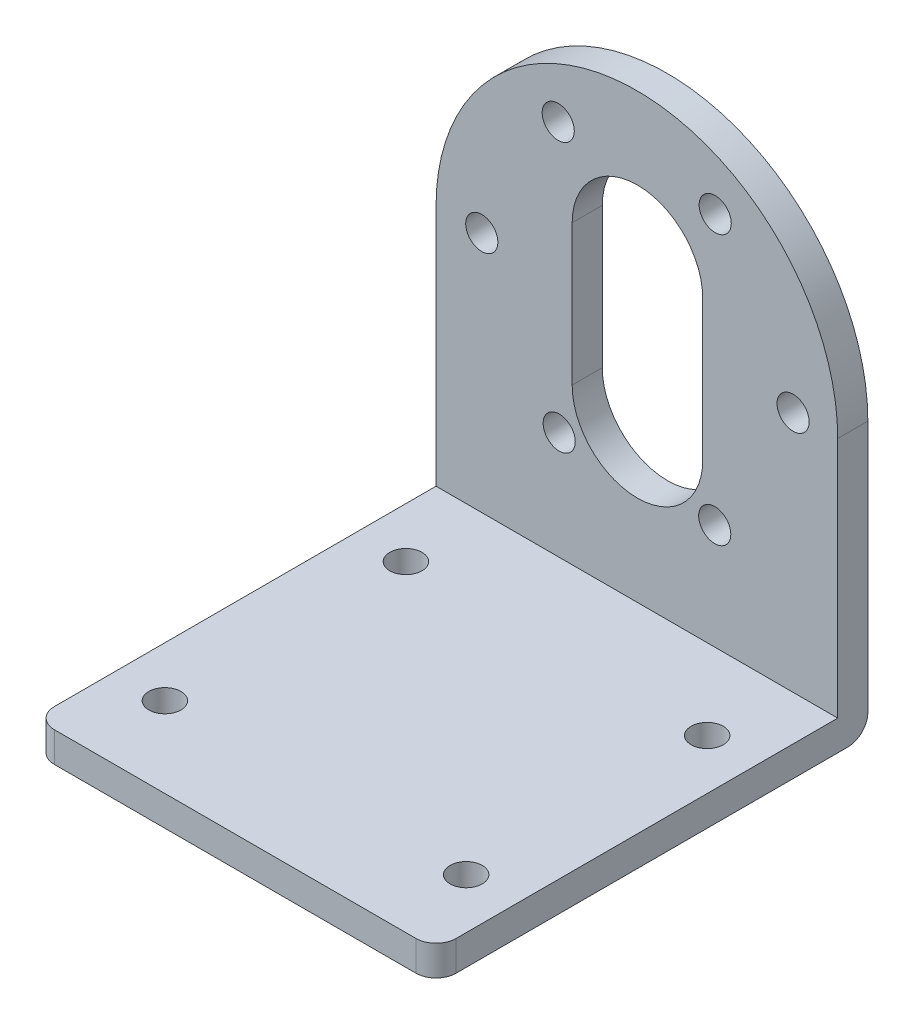
ISO-10303-21;
HEADER;
FILE_DESCRIPTION(('STEP AP214'),'2;1');
FILE_NAME('part.step','',(''),(''),'','','');
FILE_SCHEMA(('AUTOMOTIVE_DESIGN { 1 0 10303 214 1 1 1 1 }'));
ENDSEC;
DATA;
#1=APPLICATION_CONTEXT('core data for automotive mechanical design processes');
#2=APPLICATION_PROTOCOL_DEFINITION('international standard','automotive_design',2000,#1);
#3=PRODUCT_CONTEXT('',#1,'mechanical');
#4=PRODUCT('Part','Part','',(#3));
#5=PRODUCT_RELATED_PRODUCT_CATEGORY('part','',(#4));
#6=PRODUCT_DEFINITION_FORMATION('','',#4);
#7=PRODUCT_DEFINITION_CONTEXT('part definition',#1,'design');
#8=PRODUCT_DEFINITION('design','',#6,#7);
#9=PRODUCT_DEFINITION_SHAPE('','',#8);
#10=(LENGTH_UNIT() NAMED_UNIT(*) SI_UNIT(.MILLI.,.METRE.));
#11=(NAMED_UNIT(*) PLANE_ANGLE_UNIT() SI_UNIT($,.RADIAN.));
#12=(NAMED_UNIT(*) SI_UNIT($,.STERADIAN.) SOLID_ANGLE_UNIT());
#13=UNCERTAINTY_MEASURE_WITH_UNIT(LENGTH_MEASURE(1.E-05),#10,'distance_accuracy_value','');
#14=(GEOMETRIC_REPRESENTATION_CONTEXT(3) GLOBAL_UNCERTAINTY_ASSIGNED_CONTEXT((#13)) GLOBAL_UNIT_ASSIGNED_CONTEXT((#10,
#11,#12)) REPRESENTATION_CONTEXT('',''));
#15=CARTESIAN_POINT('',(0.,0.,0.));
#16=DIRECTION('',(0.,0.,1.));
#17=DIRECTION('',(1.,0.,0.));
#18=AXIS2_PLACEMENT_3D('',#15,#16,#17);
#19=CARTESIAN_POINT('',(2.78694441785257,18.9087809015992,2.99999999999998));
#20=DIRECTION('',(0.,0.,-1.));
#21=DIRECTION('',(-1.,0.,0.));
#22=AXIS2_PLACEMENT_3D('',#19,#20,#21);
#23=CYLINDRICAL_SURFACE('',#22,20.);
#24=CARTESIAN_POINT('',(2.78694441785257,18.9087809015992,0.));
#25=DIRECTION('',(0.,0.,1.));
#26=DIRECTION('',(1.,0.,0.));
#27=AXIS2_PLACEMENT_3D('',#24,#25,#26);
#28=CIRCLE('',#27,20.);
#29=CARTESIAN_POINT('',(-17.2130555821474,18.9087809015992,0.));
#30=VERTEX_POINT('',#29);
#31=CARTESIAN_POINT('',(22.7869444178526,18.9087809015992,0.));
#32=VERTEX_POINT('',#31);
#33=EDGE_CURVE('E213',#30,#32,#28,.F.);
#34=ORIENTED_EDGE('',*,*,#33,.F.);
#35=DIRECTION('',(0.,0.,-1.));
#36=VECTOR('',#35,1.);
#37=CARTESIAN_POINT('',(-17.2130555821474,18.9087809015992,2.99999999999998));
#38=LINE('',#37,#36);
#39=CARTESIAN_POINT('',(-17.2130555821474,18.9087809015992,2.99999999999998));
#40=VERTEX_POINT('',#39);
#41=EDGE_CURVE('E228',#40,#30,#38,.T.);
#42=ORIENTED_EDGE('',*,*,#41,.F.);
#43=CARTESIAN_POINT('',(2.78694441785257,18.9087809015992,2.99999999999998));
#44=DIRECTION('',(0.,0.,1.));
#45=DIRECTION('',(1.,0.,0.));
#46=AXIS2_PLACEMENT_3D('',#43,#44,#45);
#47=CIRCLE('',#46,20.);
#48=CARTESIAN_POINT('',(22.7869444178526,18.9087809015992,2.99999999999998));
#49=VERTEX_POINT('',#48);
#50=EDGE_CURVE('E163',#40,#49,#47,.F.);
#51=ORIENTED_EDGE('',*,*,#50,.T.);
#52=DIRECTION('',(0.,0.,-1.));
#53=VECTOR('',#52,1.);
#54=CARTESIAN_POINT('',(22.7869444178526,18.9087809015992,2.99999999999998));
#55=LINE('',#54,#53);
#56=EDGE_CURVE('E224',#49,#32,#55,.T.);
#57=ORIENTED_EDGE('',*,*,#56,.T.);
#58=EDGE_LOOP('',(#34,#42,#51,#57));
#59=FACE_BOUND('',#58,.T.);
#60=ADVANCED_FACE('F41',(#59),#23,.T.);
#61=CARTESIAN_POINT('',(-17.2130555821474,0.,2.99999999999998));
#62=DIRECTION('',(-1.,0.,0.));
#63=DIRECTION('',(0.,0.,1.));
#64=AXIS2_PLACEMENT_3D('',#61,#62,#63);
#65=PLANE('',#64);
#66=DIRECTION('',(0.,1.,0.));
#67=VECTOR('',#66,1.);
#68=CARTESIAN_POINT('',(-17.2130555821474,0.,0.));
#69=LINE('',#68,#67);
#70=CARTESIAN_POINT('',(-17.2130555821474,-6.20395057940297,0.));
#71=VERTEX_POINT('',#70);
#72=EDGE_CURVE('E217',#71,#30,#69,.T.);
#73=ORIENTED_EDGE('',*,*,#72,.F.);
#74=CARTESIAN_POINT('',(-17.2130555821474,-6.20395057940297,2.));
#75=DIRECTION('',(-1.,0.,0.));
#76=DIRECTION('',(0.,0.,1.));
#77=AXIS2_PLACEMENT_3D('',#74,#75,#76);
#78=CIRCLE('',#77,2.);
#79=CARTESIAN_POINT('',(-17.2130555821474,-8.20395057940297,2.));
#80=VERTEX_POINT('',#79);
#81=EDGE_CURVE('E11',#71,#80,#78,.T.);
#82=ORIENTED_EDGE('',*,*,#81,.T.);
#83=DIRECTION('',(0.,0.,-1.));
#84=VECTOR('',#83,1.);
#85=CARTESIAN_POINT('',(-17.2130555821474,-8.20395057940297,43.));
#86=LINE('',#85,#84);
#87=CARTESIAN_POINT('',(-17.2130555821474,-8.20395057940297,41.));
#88=VERTEX_POINT('',#87);
#89=EDGE_CURVE('E148',#88,#80,#86,.T.);
#90=ORIENTED_EDGE('',*,*,#89,.F.);
#91=DIRECTION('',(0.,-1.,0.));
#92=VECTOR('',#91,1.);
#93=CARTESIAN_POINT('',(-17.2130555821474,-5.20395057940296,41.));
#94=LINE('',#93,#92);
#95=CARTESIAN_POINT('',(-17.2130555821474,-5.20395057940296,41.));
#96=VERTEX_POINT('',#95);
#97=EDGE_CURVE('E143',#88,#96,#94,.F.);
#98=ORIENTED_EDGE('',*,*,#97,.T.);
#99=DIRECTION('',(0.,0.,-1.));
#100=VECTOR('',#99,1.);
#101=CARTESIAN_POINT('',(-17.2130555821474,-5.20395057940296,43.));
#102=LINE('',#101,#100);
#103=CARTESIAN_POINT('',(-17.2130555821474,-5.20395057940296,2.99999999999998));
#104=VERTEX_POINT('',#103);
#105=EDGE_CURVE('E135',#96,#104,#102,.T.);
#106=ORIENTED_EDGE('',*,*,#105,.T.);
#107=DIRECTION('',(0.,1.,0.));
#108=VECTOR('',#107,1.);
#109=CARTESIAN_POINT('',(-17.2130555821474,0.,2.99999999999998));
#110=LINE('',#109,#108);
#111=EDGE_CURVE('E140',#104,#40,#110,.T.);
#112=ORIENTED_EDGE('',*,*,#111,.T.);
#113=ORIENTED_EDGE('',*,*,#41,.T.);
#114=EDGE_LOOP('',(#73,#82,#90,#98,#106,#112,#113));
#115=FACE_BOUND('',#114,.T.);
#116=ADVANCED_FACE('F137',(#115),#65,.T.);
#117=CARTESIAN_POINT('',(2.84331015835363,24.296049420597,2.99999999999998));
#118=DIRECTION('',(0.,0.,-1.));
#119=DIRECTION('',(-1.,0.,0.));
#120=AXIS2_PLACEMENT_3D('',#117,#118,#119);
#121=CYLINDRICAL_SURFACE('',#120,6.5);
#122=CARTESIAN_POINT('',(2.84331015835363,24.296049420597,0.));
#123=DIRECTION('',(0.,0.,1.));
#124=DIRECTION('',(1.,0.,0.));
#125=AXIS2_PLACEMENT_3D('',#122,#123,#124);
#126=CIRCLE('',#125,6.5);
#127=CARTESIAN_POINT('',(9.34331015835363,24.296049420597,0.));
#128=VERTEX_POINT('',#127);
#129=CARTESIAN_POINT('',(-3.65668984164637,24.296049420597,0.));
#130=VERTEX_POINT('',#129);
#131=EDGE_CURVE('E197',#128,#130,#126,.T.);
#132=ORIENTED_EDGE('',*,*,#131,.F.);
#133=DIRECTION('',(0.,0.,-1.));
#134=VECTOR('',#133,1.);
#135=CARTESIAN_POINT('',(9.34331015835363,24.296049420597,2.99999999999998));
#136=LINE('',#135,#134);
#137=CARTESIAN_POINT('',(9.34331015835363,24.296049420597,2.99999999999998));
#138=VERTEX_POINT('',#137);
#139=EDGE_CURVE('E229',#138,#128,#136,.T.);
#140=ORIENTED_EDGE('',*,*,#139,.F.);
#141=CARTESIAN_POINT('',(2.84331015835363,24.296049420597,2.99999999999998));
#142=DIRECTION('',(0.,0.,1.));
#143=DIRECTION('',(1.,0.,0.));
#144=AXIS2_PLACEMENT_3D('',#141,#142,#143);
#145=CIRCLE('',#144,6.5);
#146=CARTESIAN_POINT('',(-3.65668984164637,24.296049420597,2.99999999999998));
#147=VERTEX_POINT('',#146);
#148=EDGE_CURVE('E317',#138,#147,#145,.T.);
#149=ORIENTED_EDGE('',*,*,#148,.T.);
#150=DIRECTION('',(0.,0.,-1.));
#151=VECTOR('',#150,1.);
#152=CARTESIAN_POINT('',(-3.65668984164637,24.296049420597,2.99999999999998));
#153=LINE('',#152,#151);
#154=EDGE_CURVE('E173',#147,#130,#153,.T.);
#155=ORIENTED_EDGE('',*,*,#154,.T.);
#156=EDGE_LOOP('',(#132,#140,#149,#155));
#157=FACE_BOUND('',#156,.T.);
#158=ADVANCED_FACE('F340',(#157),#121,.F.);
#159=CARTESIAN_POINT('',(9.34331015835363,0.,2.99999999999998));
#160=DIRECTION('',(-1.,0.,0.));
#161=DIRECTION('',(0.,0.,1.));
#162=AXIS2_PLACEMENT_3D('',#159,#160,#161);
#163=PLANE('',#162);
#164=DIRECTION('',(0.,1.,0.));
#165=VECTOR('',#164,1.);
#166=CARTESIAN_POINT('',(9.34331015835363,0.,0.));
#167=LINE('',#166,#165);
#168=CARTESIAN_POINT('',(9.34331015835363,10.296049420597,0.));
#169=VERTEX_POINT('',#168);
#170=EDGE_CURVE('E201',#169,#128,#167,.T.);
#171=ORIENTED_EDGE('',*,*,#170,.F.);
#172=DIRECTION('',(0.,0.,-1.));
#173=VECTOR('',#172,1.);
#174=CARTESIAN_POINT('',(9.34331015835363,10.296049420597,2.99999999999998));
#175=LINE('',#174,#173);
#176=CARTESIAN_POINT('',(9.34331015835363,10.296049420597,2.99999999999998));
#177=VERTEX_POINT('',#176);
#178=EDGE_CURVE('E238',#177,#169,#175,.T.);
#179=ORIENTED_EDGE('',*,*,#178,.F.);
#180=DIRECTION('',(0.,1.,0.));
#181=VECTOR('',#180,1.);
#182=CARTESIAN_POINT('',(9.34331015835363,0.,2.99999999999998));
#183=LINE('',#182,#181);
#184=EDGE_CURVE('E321',#177,#138,#183,.T.);
#185=ORIENTED_EDGE('',*,*,#184,.T.);
#186=ORIENTED_EDGE('',*,*,#139,.T.);
#187=EDGE_LOOP('',(#171,#179,#185,#186));
#188=FACE_BOUND('',#187,.T.);
#189=ADVANCED_FACE('F343',(#188),#163,.T.);
#190=CARTESIAN_POINT('',(2.84331015835363,10.296049420597,2.99999999999998));
#191=DIRECTION('',(0.,0.,-1.));
#192=DIRECTION('',(-1.,0.,0.));
#193=AXIS2_PLACEMENT_3D('',#190,#191,#192);
#194=CYLINDRICAL_SURFACE('',#193,6.5);
#195=CARTESIAN_POINT('',(2.84331015835363,10.296049420597,0.));
#196=DIRECTION('',(0.,0.,1.));
#197=DIRECTION('',(1.,0.,0.));
#198=AXIS2_PLACEMENT_3D('',#195,#196,#197);
#199=CIRCLE('',#198,6.5);
#200=CARTESIAN_POINT('',(-3.65668984164637,10.296049420597,0.));
#201=VERTEX_POINT('',#200);
#202=EDGE_CURVE('E205',#201,#169,#199,.T.);
#203=ORIENTED_EDGE('',*,*,#202,.F.);
#204=DIRECTION('',(0.,0.,-1.));
#205=VECTOR('',#204,1.);
#206=CARTESIAN_POINT('',(-3.65668984164637,10.296049420597,2.99999999999998));
#207=LINE('',#206,#205);
#208=CARTESIAN_POINT('',(-3.65668984164637,10.296049420597,2.99999999999998));
#209=VERTEX_POINT('',#208);
#210=EDGE_CURVE('E235',#209,#201,#207,.T.);
#211=ORIENTED_EDGE('',*,*,#210,.F.);
#212=CARTESIAN_POINT('',(2.84331015835363,10.296049420597,2.99999999999998));
#213=DIRECTION('',(0.,0.,1.));
#214=DIRECTION('',(1.,0.,0.));
#215=AXIS2_PLACEMENT_3D('',#212,#213,#214);
#216=CIRCLE('',#215,6.5);
#217=EDGE_CURVE('E325',#209,#177,#216,.T.);
#218=ORIENTED_EDGE('',*,*,#217,.T.);
#219=ORIENTED_EDGE('',*,*,#178,.T.);
#220=EDGE_LOOP('',(#203,#211,#218,#219));
#221=FACE_BOUND('',#220,.T.);
#222=ADVANCED_FACE('F346',(#221),#194,.F.);
#223=CARTESIAN_POINT('',(-3.65668984164637,0.,2.99999999999998));
#224=DIRECTION('',(-1.,0.,0.));
#225=DIRECTION('',(0.,0.,1.));
#226=AXIS2_PLACEMENT_3D('',#223,#224,#225);
#227=PLANE('',#226);
#228=DIRECTION('',(0.,1.,0.));
#229=VECTOR('',#228,1.);
#230=CARTESIAN_POINT('',(-3.65668984164637,0.,0.));
#231=LINE('',#230,#229);
#232=EDGE_CURVE('E209',#201,#130,#231,.T.);
#233=ORIENTED_EDGE('',*,*,#232,.T.);
#234=ORIENTED_EDGE('',*,*,#154,.F.);
#235=DIRECTION('',(0.,1.,0.));
#236=VECTOR('',#235,1.);
#237=CARTESIAN_POINT('',(-3.65668984164637,0.,2.99999999999998));
#238=LINE('',#237,#236);
#239=EDGE_CURVE('E167',#209,#147,#238,.T.);
#240=ORIENTED_EDGE('',*,*,#239,.F.);
#241=ORIENTED_EDGE('',*,*,#210,.T.);
#242=EDGE_LOOP('',(#233,#234,#240,#241));
#243=FACE_BOUND('',#242,.T.);
#244=ADVANCED_FACE('F336',(#243),#227,.F.);
#245=CARTESIAN_POINT('',(-12.6566898416464,18.9087809015992,2.99999999999998));
#246=DIRECTION('',(0.,0.,-1.));
#247=DIRECTION('',(-1.,0.,0.));
#248=AXIS2_PLACEMENT_3D('',#245,#246,#247);
#249=CYLINDRICAL_SURFACE('',#248,1.6);
#250=CARTESIAN_POINT('',(-12.6566898416464,18.9087809015992,2.99999999999998));
#251=DIRECTION('',(0.,0.,1.));
#252=DIRECTION('',(1.,0.,0.));
#253=AXIS2_PLACEMENT_3D('',#250,#251,#252);
#254=CIRCLE('',#253,1.6);
#255=CARTESIAN_POINT('',(-11.0566898416464,18.9087809015992,2.99999999999998));
#256=VERTEX_POINT('',#255);
#257=EDGE_CURVE('E313',#256,#256,#254,.T.);
#258=ORIENTED_EDGE('',*,*,#257,.T.);
#259=EDGE_LOOP('',(#258));
#260=FACE_BOUND('',#259,.T.);
#261=CARTESIAN_POINT('',(-12.6566898416464,18.9087809015992,0.));
#262=DIRECTION('',(0.,0.,1.));
#263=DIRECTION('',(1.,0.,0.));
#264=AXIS2_PLACEMENT_3D('',#261,#262,#263);
#265=CIRCLE('',#264,1.6);
#266=CARTESIAN_POINT('',(-11.0566898416464,18.9087809015992,0.));
#267=VERTEX_POINT('',#266);
#268=EDGE_CURVE('E193',#267,#267,#265,.T.);
#269=ORIENTED_EDGE('',*,*,#268,.F.);
#270=EDGE_LOOP('',(#269));
#271=FACE_BOUND('',#270,.T.);
#272=ADVANCED_FACE('F435',(#260,#271),#249,.F.);
#273=CARTESIAN_POINT('',(18.3433101583536,18.9087809015992,2.99999999999998));
#274=DIRECTION('',(0.,0.,-1.));
#275=DIRECTION('',(-1.,0.,0.));
#276=AXIS2_PLACEMENT_3D('',#273,#274,#275);
#277=CYLINDRICAL_SURFACE('',#276,1.6);
#278=CARTESIAN_POINT('',(18.3433101583536,18.9087809015992,2.99999999999998));
#279=DIRECTION('',(0.,0.,1.));
#280=DIRECTION('',(1.,0.,0.));
#281=AXIS2_PLACEMENT_3D('',#278,#279,#280);
#282=CIRCLE('',#281,1.6);
#283=CARTESIAN_POINT('',(19.9433101583536,18.9087809015992,2.99999999999998));
#284=VERTEX_POINT('',#283);
#285=EDGE_CURVE('E309',#284,#284,#282,.T.);
#286=ORIENTED_EDGE('',*,*,#285,.T.);
#287=EDGE_LOOP('',(#286));
#288=FACE_BOUND('',#287,.T.);
#289=CARTESIAN_POINT('',(18.3433101583536,18.9087809015992,0.));
#290=DIRECTION('',(0.,0.,1.));
#291=DIRECTION('',(1.,0.,0.));
#292=AXIS2_PLACEMENT_3D('',#289,#290,#291);
#293=CIRCLE('',#292,1.6);
#294=CARTESIAN_POINT('',(19.9433101583536,18.9087809015992,0.));
#295=VERTEX_POINT('',#294);
#296=EDGE_CURVE('E189',#295,#295,#293,.T.);
#297=ORIENTED_EDGE('',*,*,#296,.F.);
#298=EDGE_LOOP('',(#297));
#299=FACE_BOUND('',#298,.T.);
#300=ADVANCED_FACE('F444',(#288,#299),#277,.F.);
#301=CARTESIAN_POINT('',(-5.04575774757438,32.2974738550384,2.99999999999998));
#302=DIRECTION('',(0.,0.,-1.));
#303=DIRECTION('',(-1.,0.,0.));
#304=AXIS2_PLACEMENT_3D('',#301,#302,#303);
#305=CYLINDRICAL_SURFACE('',#304,1.6);
#306=CARTESIAN_POINT('',(-5.04575774757438,32.2974738550384,2.99999999999998));
#307=DIRECTION('',(0.,0.,1.));
#308=DIRECTION('',(1.,0.,0.));
#309=AXIS2_PLACEMENT_3D('',#306,#307,#308);
#310=CIRCLE('',#309,1.6);
#311=CARTESIAN_POINT('',(-3.44575774757437,32.2974738550384,2.99999999999998));
#312=VERTEX_POINT('',#311);
#313=EDGE_CURVE('E305',#312,#312,#310,.T.);
#314=ORIENTED_EDGE('',*,*,#313,.T.);
#315=EDGE_LOOP('',(#314));
#316=FACE_BOUND('',#315,.T.);
#317=CARTESIAN_POINT('',(-5.04575774757438,32.2974738550384,0.));
#318=DIRECTION('',(0.,0.,1.));
#319=DIRECTION('',(1.,0.,0.));
#320=AXIS2_PLACEMENT_3D('',#317,#318,#319);
#321=CIRCLE('',#320,1.6);
#322=CARTESIAN_POINT('',(-3.44575774757437,32.2974738550384,0.));
#323=VERTEX_POINT('',#322);
#324=EDGE_CURVE('E185',#323,#323,#321,.T.);
#325=ORIENTED_EDGE('',*,*,#324,.F.);
#326=EDGE_LOOP('',(#325));
#327=FACE_BOUND('',#326,.T.);
#328=ADVANCED_FACE('F448',(#316,#327),#305,.F.);
#329=CARTESIAN_POINT('',(10.5867536215317,32.1606042090358,2.99999999999998));
#330=DIRECTION('',(0.,0.,-1.));
#331=DIRECTION('',(-1.,0.,0.));
#332=AXIS2_PLACEMENT_3D('',#329,#330,#331);
#333=CYLINDRICAL_SURFACE('',#332,1.6);
#334=CARTESIAN_POINT('',(10.5867536215317,32.1606042090358,2.99999999999998));
#335=DIRECTION('',(0.,0.,1.));
#336=DIRECTION('',(1.,0.,0.));
#337=AXIS2_PLACEMENT_3D('',#334,#335,#336);
#338=CIRCLE('',#337,1.6);
#339=CARTESIAN_POINT('',(12.1867536215317,32.1606042090358,2.99999999999998));
#340=VERTEX_POINT('',#339);
#341=EDGE_CURVE('E301',#340,#340,#338,.T.);
#342=ORIENTED_EDGE('',*,*,#341,.T.);
#343=EDGE_LOOP('',(#342));
#344=FACE_BOUND('',#343,.T.);
#345=CARTESIAN_POINT('',(10.5867536215317,32.1606042090358,0.));
#346=DIRECTION('',(0.,0.,1.));
#347=DIRECTION('',(1.,0.,0.));
#348=AXIS2_PLACEMENT_3D('',#345,#346,#347);
#349=CIRCLE('',#348,1.6);
#350=CARTESIAN_POINT('',(12.1867536215317,32.1606042090358,0.));
#351=VERTEX_POINT('',#350);
#352=EDGE_CURVE('E181',#351,#351,#349,.T.);
#353=ORIENTED_EDGE('',*,*,#352,.F.);
#354=EDGE_LOOP('',(#353));
#355=FACE_BOUND('',#354,.T.);
#356=ADVANCED_FACE('F452',(#344,#355),#333,.F.);
#357=CARTESIAN_POINT('',(10.5392478332105,5.3198338075441,2.99999999999998));
#358=DIRECTION('',(0.,0.,-1.));
#359=DIRECTION('',(-1.,0.,0.));
#360=AXIS2_PLACEMENT_3D('',#357,#358,#359);
#361=CYLINDRICAL_SURFACE('',#360,1.6);
#362=CARTESIAN_POINT('',(10.5392478332105,5.3198338075441,2.99999999999998));
#363=DIRECTION('',(0.,0.,1.));
#364=DIRECTION('',(1.,0.,0.));
#365=AXIS2_PLACEMENT_3D('',#362,#363,#364);
#366=CIRCLE('',#365,1.6);
#367=CARTESIAN_POINT('',(12.1392478332105,5.3198338075441,2.99999999999998));
#368=VERTEX_POINT('',#367);
#369=EDGE_CURVE('E297',#368,#368,#366,.T.);
#370=ORIENTED_EDGE('',*,*,#369,.T.);
#371=EDGE_LOOP('',(#370));
#372=FACE_BOUND('',#371,.T.);
#373=CARTESIAN_POINT('',(10.5392478332105,5.3198338075441,0.));
#374=DIRECTION('',(0.,0.,1.));
#375=DIRECTION('',(1.,0.,0.));
#376=AXIS2_PLACEMENT_3D('',#373,#374,#375);
#377=CIRCLE('',#376,1.6);
#378=CARTESIAN_POINT('',(12.1392478332105,5.3198338075441,0.));
#379=VERTEX_POINT('',#378);
#380=EDGE_CURVE('E177',#379,#379,#377,.T.);
#381=ORIENTED_EDGE('',*,*,#380,.F.);
#382=EDGE_LOOP('',(#381));
#383=FACE_BOUND('',#382,.T.);
#384=ADVANCED_FACE('F456',(#372,#383),#361,.F.);
#385=CARTESIAN_POINT('',(-4.94763915950864,5.55736274915022,2.99999999999998));
#386=DIRECTION('',(0.,0.,-1.));
#387=DIRECTION('',(-1.,0.,0.));
#388=AXIS2_PLACEMENT_3D('',#385,#386,#387);
#389=CYLINDRICAL_SURFACE('',#388,1.6);
#390=CARTESIAN_POINT('',(-4.94763915950864,5.55736274915022,2.99999999999998));
#391=DIRECTION('',(0.,0.,1.));
#392=DIRECTION('',(1.,0.,0.));
#393=AXIS2_PLACEMENT_3D('',#390,#391,#392);
#394=CIRCLE('',#393,1.6);
#395=CARTESIAN_POINT('',(-3.34763915950864,5.55736274915022,2.99999999999998));
#396=VERTEX_POINT('',#395);
#397=EDGE_CURVE('E223',#396,#396,#394,.T.);
#398=ORIENTED_EDGE('',*,*,#397,.T.);
#399=EDGE_LOOP('',(#398));
#400=FACE_BOUND('',#399,.T.);
#401=CARTESIAN_POINT('',(-4.94763915950864,5.55736274915022,0.));
#402=DIRECTION('',(0.,0.,1.));
#403=DIRECTION('',(1.,0.,0.));
#404=AXIS2_PLACEMENT_3D('',#401,#402,#403);
#405=CIRCLE('',#404,1.6);
#406=CARTESIAN_POINT('',(-3.34763915950864,5.55736274915022,0.));
#407=VERTEX_POINT('',#406);
#408=EDGE_CURVE('E147',#407,#407,#405,.T.);
#409=ORIENTED_EDGE('',*,*,#408,.F.);
#410=EDGE_LOOP('',(#409));
#411=FACE_BOUND('',#410,.T.);
#412=ADVANCED_FACE('F460',(#400,#411),#389,.F.);
#413=CARTESIAN_POINT('',(22.7869444178526,0.,2.99999999999998));
#414=DIRECTION('',(-1.,0.,0.));
#415=DIRECTION('',(0.,0.,1.));
#416=AXIS2_PLACEMENT_3D('',#413,#414,#415);
#417=PLANE('',#416);
#418=DIRECTION('',(0.,0.,-1.));
#419=VECTOR('',#418,1.);
#420=CARTESIAN_POINT('',(22.7869444178526,-8.20395057940297,43.));
#421=LINE('',#420,#419);
#422=CARTESIAN_POINT('',(22.7869444178526,-8.20395057940297,41.));
#423=VERTEX_POINT('',#422);
#424=CARTESIAN_POINT('',(22.7869444178526,-8.20395057940297,2.));
#425=VERTEX_POINT('',#424);
#426=EDGE_CURVE('E279',#423,#425,#421,.T.);
#427=ORIENTED_EDGE('',*,*,#426,.T.);
#428=CARTESIAN_POINT('',(22.7869444178526,-6.20395057940296,2.));
#429=DIRECTION('',(-1.,0.,0.));
#430=DIRECTION('',(0.,0.,1.));
#431=AXIS2_PLACEMENT_3D('',#428,#429,#430);
#432=CIRCLE('',#431,2.);
#433=CARTESIAN_POINT('',(22.7869444178526,-6.20395057940296,0.));
#434=VERTEX_POINT('',#433);
#435=EDGE_CURVE('E64',#425,#434,#432,.F.);
#436=ORIENTED_EDGE('',*,*,#435,.T.);
#437=DIRECTION('',(0.,1.,0.));
#438=VECTOR('',#437,1.);
#439=CARTESIAN_POINT('',(22.7869444178526,0.,0.));
#440=LINE('',#439,#438);
#441=EDGE_CURVE('E220',#434,#32,#440,.T.);
#442=ORIENTED_EDGE('',*,*,#441,.T.);
#443=ORIENTED_EDGE('',*,*,#56,.F.);
#444=DIRECTION('',(0.,1.,0.));
#445=VECTOR('',#444,1.);
#446=CARTESIAN_POINT('',(22.7869444178526,0.,2.99999999999998));
#447=LINE('',#446,#445);
#448=CARTESIAN_POINT('',(22.7869444178526,-5.20395057940296,2.99999999999998));
#449=VERTEX_POINT('',#448);
#450=EDGE_CURVE('E158',#449,#49,#447,.T.);
#451=ORIENTED_EDGE('',*,*,#450,.F.);
#452=DIRECTION('',(0.,0.,-1.));
#453=VECTOR('',#452,1.);
#454=CARTESIAN_POINT('',(22.7869444178526,-5.20395057940296,43.));
#455=LINE('',#454,#453);
#456=CARTESIAN_POINT('',(22.7869444178526,-5.20395057940296,41.));
#457=VERTEX_POINT('',#456);
#458=EDGE_CURVE('E154',#457,#449,#455,.T.);
#459=ORIENTED_EDGE('',*,*,#458,.F.);
#460=DIRECTION('',(0.,1.,0.));
#461=VECTOR('',#460,1.);
#462=CARTESIAN_POINT('',(22.7869444178526,0.,41.));
#463=LINE('',#462,#461);
#464=EDGE_CURVE('E249',#457,#423,#463,.F.);
#465=ORIENTED_EDGE('',*,*,#464,.T.);
#466=EDGE_LOOP('',(#427,#436,#442,#443,#451,#459,#465));
#467=FACE_BOUND('',#466,.T.);
#468=ADVANCED_FACE('F283',(#467),#417,.F.);
#469=CARTESIAN_POINT('',(0.,0.,2.99999999999998));
#470=DIRECTION('',(0.,0.,1.));
#471=DIRECTION('',(1.,0.,0.));
#472=AXIS2_PLACEMENT_3D('',#469,#470,#471);
#473=PLANE('',#472);
#474=ORIENTED_EDGE('',*,*,#397,.F.);
#475=EDGE_LOOP('',(#474));
#476=FACE_BOUND('',#475,.T.);
#477=ORIENTED_EDGE('',*,*,#369,.F.);
#478=EDGE_LOOP('',(#477));
#479=FACE_BOUND('',#478,.T.);
#480=ORIENTED_EDGE('',*,*,#341,.F.);
#481=EDGE_LOOP('',(#480));
#482=FACE_BOUND('',#481,.T.);
#483=ORIENTED_EDGE('',*,*,#313,.F.);
#484=EDGE_LOOP('',(#483));
#485=FACE_BOUND('',#484,.T.);
#486=ORIENTED_EDGE('',*,*,#285,.F.);
#487=EDGE_LOOP('',(#486));
#488=FACE_BOUND('',#487,.T.);
#489=ORIENTED_EDGE('',*,*,#257,.F.);
#490=EDGE_LOOP('',(#489));
#491=FACE_BOUND('',#490,.T.);
#492=ORIENTED_EDGE('',*,*,#148,.F.);
#493=ORIENTED_EDGE('',*,*,#184,.F.);
#494=ORIENTED_EDGE('',*,*,#217,.F.);
#495=ORIENTED_EDGE('',*,*,#239,.T.);
#496=EDGE_LOOP('',(#492,#493,#494,#495));
#497=FACE_BOUND('',#496,.T.);
#498=ORIENTED_EDGE('',*,*,#50,.F.);
#499=ORIENTED_EDGE('',*,*,#111,.F.);
#500=DIRECTION('',(1.,0.,0.));
#501=VECTOR('',#500,1.);
#502=CARTESIAN_POINT('',(0.,-5.20395057940296,2.99999999999998));
#503=LINE('',#502,#501);
#504=EDGE_CURVE('E151',#104,#449,#503,.T.);
#505=ORIENTED_EDGE('',*,*,#504,.T.);
#506=ORIENTED_EDGE('',*,*,#450,.T.);
#507=EDGE_LOOP('',(#498,#499,#505,#506));
#508=FACE_BOUND('',#507,.T.);
#509=ADVANCED_FACE('F161',(#476,#479,#482,#485,#488,#491,#497,#508),#473,.T.);
#510=CARTESIAN_POINT('',(0.,0.,0.));
#511=DIRECTION('',(0.,0.,1.));
#512=DIRECTION('',(1.,0.,0.));
#513=AXIS2_PLACEMENT_3D('',#510,#511,#512);
#514=PLANE('',#513);
#515=ORIENTED_EDGE('',*,*,#408,.T.);
#516=EDGE_LOOP('',(#515));
#517=FACE_BOUND('',#516,.T.);
#518=ORIENTED_EDGE('',*,*,#380,.T.);
#519=EDGE_LOOP('',(#518));
#520=FACE_BOUND('',#519,.T.);
#521=ORIENTED_EDGE('',*,*,#352,.T.);
#522=EDGE_LOOP('',(#521));
#523=FACE_BOUND('',#522,.T.);
#524=ORIENTED_EDGE('',*,*,#324,.T.);
#525=EDGE_LOOP('',(#524));
#526=FACE_BOUND('',#525,.T.);
#527=ORIENTED_EDGE('',*,*,#296,.T.);
#528=EDGE_LOOP('',(#527));
#529=FACE_BOUND('',#528,.T.);
#530=ORIENTED_EDGE('',*,*,#268,.T.);
#531=EDGE_LOOP('',(#530));
#532=FACE_BOUND('',#531,.T.);
#533=ORIENTED_EDGE('',*,*,#131,.T.);
#534=ORIENTED_EDGE('',*,*,#232,.F.);
#535=ORIENTED_EDGE('',*,*,#202,.T.);
#536=ORIENTED_EDGE('',*,*,#170,.T.);
#537=EDGE_LOOP('',(#533,#534,#535,#536));
#538=FACE_BOUND('',#537,.T.);
#539=ORIENTED_EDGE('',*,*,#441,.F.);
#540=DIRECTION('',(1.,0.,0.));
#541=VECTOR('',#540,1.);
#542=CARTESIAN_POINT('',(0.,-6.20395057940297,0.));
#543=LINE('',#542,#541);
#544=EDGE_CURVE('E50',#434,#71,#543,.F.);
#545=ORIENTED_EDGE('',*,*,#544,.T.);
#546=ORIENTED_EDGE('',*,*,#72,.T.);
#547=ORIENTED_EDGE('',*,*,#33,.T.);
#548=EDGE_LOOP('',(#539,#545,#546,#547));
#549=FACE_BOUND('',#548,.T.);
#550=ADVANCED_FACE('F348',(#517,#520,#523,#526,#529,#532,#538,#549),#514,.F.);
#551=CARTESIAN_POINT('',(22.7869444178526,-5.20395057940296,43.));
#552=DIRECTION('',(0.,-1.,0.));
#553=DIRECTION('',(0.,0.,-1.));
#554=AXIS2_PLACEMENT_3D('',#551,#552,#553);
#555=PLANE('',#554);
#556=CARTESIAN_POINT('',(-12.2130555821474,-5.20395057940296,11.));
#557=DIRECTION('',(0.,-1.,0.));
#558=DIRECTION('',(0.,0.,-1.));
#559=AXIS2_PLACEMENT_3D('',#556,#557,#558);
#560=CIRCLE('',#559,1.6);
#561=CARTESIAN_POINT('',(-12.2130555821474,-5.20395057940296,9.39999999999999));
#562=VERTEX_POINT('',#561);
#563=EDGE_CURVE('E364',#562,#562,#560,.T.);
#564=ORIENTED_EDGE('',*,*,#563,.T.);
#565=EDGE_LOOP('',(#564));
#566=FACE_BOUND('',#565,.T.);
#567=CARTESIAN_POINT('',(17.7869444178526,-5.20395057940296,11.));
#568=DIRECTION('',(0.,-1.,0.));
#569=DIRECTION('',(0.,0.,-1.));
#570=AXIS2_PLACEMENT_3D('',#567,#568,#569);
#571=CIRCLE('',#570,1.6);
#572=CARTESIAN_POINT('',(17.7869444178526,-5.20395057940296,9.39999999999999));
#573=VERTEX_POINT('',#572);
#574=EDGE_CURVE('E370',#573,#573,#571,.T.);
#575=ORIENTED_EDGE('',*,*,#574,.T.);
#576=EDGE_LOOP('',(#575));
#577=FACE_BOUND('',#576,.T.);
#578=CARTESIAN_POINT('',(17.7869444178526,-5.20395057940296,35.));
#579=DIRECTION('',(0.,-1.,0.));
#580=DIRECTION('',(0.,0.,-1.));
#581=AXIS2_PLACEMENT_3D('',#578,#579,#580);
#582=CIRCLE('',#581,1.6);
#583=CARTESIAN_POINT('',(17.7869444178526,-5.20395057940296,33.4));
#584=VERTEX_POINT('',#583);
#585=EDGE_CURVE('E374',#584,#584,#582,.T.);
#586=ORIENTED_EDGE('',*,*,#585,.T.);
#587=EDGE_LOOP('',(#586));
#588=FACE_BOUND('',#587,.T.);
#589=CARTESIAN_POINT('',(-12.2130555821474,-5.20395057940296,35.));
#590=DIRECTION('',(0.,-1.,0.));
#591=DIRECTION('',(0.,0.,-1.));
#592=AXIS2_PLACEMENT_3D('',#589,#590,#591);
#593=CIRCLE('',#592,1.6);
#594=CARTESIAN_POINT('',(-12.2130555821474,-5.20395057940296,33.4));
#595=VERTEX_POINT('',#594);
#596=EDGE_CURVE('E378',#595,#595,#593,.T.);
#597=ORIENTED_EDGE('',*,*,#596,.T.);
#598=EDGE_LOOP('',(#597));
#599=FACE_BOUND('',#598,.T.);
#600=ORIENTED_EDGE('',*,*,#105,.F.);
#601=CARTESIAN_POINT('',(-15.2130555821474,-5.20395057940296,41.));
#602=DIRECTION('',(0.,-1.,0.));
#603=DIRECTION('',(0.,0.,-1.));
#604=AXIS2_PLACEMENT_3D('',#601,#602,#603);
#605=CIRCLE('',#604,2.);
#606=CARTESIAN_POINT('',(-15.2130555821474,-5.20395057940296,43.));
#607=VERTEX_POINT('',#606);
#608=EDGE_CURVE('E265',#96,#607,#605,.F.);
#609=ORIENTED_EDGE('',*,*,#608,.T.);
#610=DIRECTION('',(-1.,0.,0.));
#611=VECTOR('',#610,1.);
#612=CARTESIAN_POINT('',(22.7869444178526,-5.20395057940296,43.));
#613=LINE('',#612,#611);
#614=CARTESIAN_POINT('',(20.7869444178526,-5.20395057940296,43.));
#615=VERTEX_POINT('',#614);
#616=EDGE_CURVE('E361',#615,#607,#613,.T.);
#617=ORIENTED_EDGE('',*,*,#616,.F.);
#618=CARTESIAN_POINT('',(20.7869444178526,-5.20395057940296,41.));
#619=DIRECTION('',(0.,-1.,0.));
#620=DIRECTION('',(0.,0.,-1.));
#621=AXIS2_PLACEMENT_3D('',#618,#619,#620);
#622=CIRCLE('',#621,2.);
#623=EDGE_CURVE('E246',#615,#457,#622,.F.);
#624=ORIENTED_EDGE('',*,*,#623,.T.);
#625=ORIENTED_EDGE('',*,*,#458,.T.);
#626=ORIENTED_EDGE('',*,*,#504,.F.);
#627=EDGE_LOOP('',(#600,#609,#617,#624,#625,#626));
#628=FACE_BOUND('',#627,.T.);
#629=ADVANCED_FACE('F152',(#566,#577,#588,#599,#628),#555,.F.);
#630=CARTESIAN_POINT('',(22.7869444178526,-8.20395057940297,43.));
#631=DIRECTION('',(0.,1.,0.));
#632=DIRECTION('',(-1.,0.,0.));
#633=AXIS2_PLACEMENT_3D('',#630,#631,#632);
#634=PLANE('',#633);
#635=CARTESIAN_POINT('',(-12.2130555821474,-8.20395057940297,11.));
#636=DIRECTION('',(0.,1.,0.));
#637=DIRECTION('',(0.,0.,1.));
#638=AXIS2_PLACEMENT_3D('',#635,#636,#637);
#639=CIRCLE('',#638,1.6);
#640=CARTESIAN_POINT('',(-12.2130555821474,-8.20395057940297,12.6));
#641=VERTEX_POINT('',#640);
#642=EDGE_CURVE('E387',#641,#641,#639,.T.);
#643=ORIENTED_EDGE('',*,*,#642,.T.);
#644=EDGE_LOOP('',(#643));
#645=FACE_BOUND('',#644,.T.);
#646=CARTESIAN_POINT('',(17.7869444178526,-8.20395057940297,11.));
#647=DIRECTION('',(0.,1.,0.));
#648=DIRECTION('',(0.,0.,1.));
#649=AXIS2_PLACEMENT_3D('',#646,#647,#648);
#650=CIRCLE('',#649,1.6);
#651=CARTESIAN_POINT('',(17.7869444178526,-8.20395057940297,12.6));
#652=VERTEX_POINT('',#651);
#653=EDGE_CURVE('E391',#652,#652,#650,.T.);
#654=ORIENTED_EDGE('',*,*,#653,.T.);
#655=EDGE_LOOP('',(#654));
#656=FACE_BOUND('',#655,.T.);
#657=CARTESIAN_POINT('',(17.7869444178526,-8.20395057940297,35.));
#658=DIRECTION('',(0.,1.,0.));
#659=DIRECTION('',(0.,0.,1.));
#660=AXIS2_PLACEMENT_3D('',#657,#658,#659);
#661=CIRCLE('',#660,1.6);
#662=CARTESIAN_POINT('',(17.7869444178526,-8.20395057940297,36.6));
#663=VERTEX_POINT('',#662);
#664=EDGE_CURVE('E386',#663,#663,#661,.T.);
#665=ORIENTED_EDGE('',*,*,#664,.T.);
#666=EDGE_LOOP('',(#665));
#667=FACE_BOUND('',#666,.T.);
#668=CARTESIAN_POINT('',(-12.2130555821474,-8.20395057940297,35.));
#669=DIRECTION('',(0.,1.,0.));
#670=DIRECTION('',(0.,0.,1.));
#671=AXIS2_PLACEMENT_3D('',#668,#669,#670);
#672=CIRCLE('',#671,1.6);
#673=CARTESIAN_POINT('',(-12.2130555821474,-8.20395057940297,36.6));
#674=VERTEX_POINT('',#673);
#675=EDGE_CURVE('E382',#674,#674,#672,.T.);
#676=ORIENTED_EDGE('',*,*,#675,.T.);
#677=EDGE_LOOP('',(#676));
#678=FACE_BOUND('',#677,.T.);
#679=ORIENTED_EDGE('',*,*,#89,.T.);
#680=DIRECTION('',(1.,0.,0.));
#681=VECTOR('',#680,1.);
#682=CARTESIAN_POINT('',(22.7869444178526,-8.20395057940297,2.));
#683=LINE('',#682,#681);
#684=EDGE_CURVE('E268',#80,#425,#683,.T.);
#685=ORIENTED_EDGE('',*,*,#684,.T.);
#686=ORIENTED_EDGE('',*,*,#426,.F.);
#687=CARTESIAN_POINT('',(20.7869444178526,-8.20395057940297,41.));
#688=DIRECTION('',(0.,1.,0.));
#689=DIRECTION('',(-1.,0.,0.));
#690=AXIS2_PLACEMENT_3D('',#687,#688,#689);
#691=CIRCLE('',#690,2.);
#692=CARTESIAN_POINT('',(20.7869444178526,-8.20395057940297,43.));
#693=VERTEX_POINT('',#692);
#694=EDGE_CURVE('E252',#423,#693,#691,.F.);
#695=ORIENTED_EDGE('',*,*,#694,.T.);
#696=DIRECTION('',(1.,0.,0.));
#697=VECTOR('',#696,1.);
#698=CARTESIAN_POINT('',(22.7869444178526,-8.20395057940297,43.));
#699=LINE('',#698,#697);
#700=CARTESIAN_POINT('',(-15.2130555821474,-8.20395057940297,43.));
#701=VERTEX_POINT('',#700);
#702=EDGE_CURVE('E290',#701,#693,#699,.T.);
#703=ORIENTED_EDGE('',*,*,#702,.F.);
#704=CARTESIAN_POINT('',(-15.2130555821474,-8.20395057940297,41.));
#705=DIRECTION('',(0.,1.,0.));
#706=DIRECTION('',(-1.,0.,0.));
#707=AXIS2_PLACEMENT_3D('',#704,#705,#706);
#708=CIRCLE('',#707,2.);
#709=EDGE_CURVE('E260',#701,#88,#708,.F.);
#710=ORIENTED_EDGE('',*,*,#709,.T.);
#711=EDGE_LOOP('',(#679,#685,#686,#695,#703,#710));
#712=FACE_BOUND('',#711,.T.);
#713=ADVANCED_FACE('F278',(#645,#656,#667,#678,#712),#634,.F.);
#714=CARTESIAN_POINT('',(0.,0.,43.));
#715=DIRECTION('',(0.,0.,-1.));
#716=DIRECTION('',(-1.,0.,0.));
#717=AXIS2_PLACEMENT_3D('',#714,#715,#716);
#718=PLANE('',#717);
#719=ORIENTED_EDGE('',*,*,#616,.T.);
#720=DIRECTION('',(0.,-1.,0.));
#721=VECTOR('',#720,1.);
#722=CARTESIAN_POINT('',(-15.2130555821474,-8.20395057940297,43.));
#723=LINE('',#722,#721);
#724=EDGE_CURVE('E256',#607,#701,#723,.T.);
#725=ORIENTED_EDGE('',*,*,#724,.T.);
#726=ORIENTED_EDGE('',*,*,#702,.T.);
#727=DIRECTION('',(0.,1.,0.));
#728=VECTOR('',#727,1.);
#729=CARTESIAN_POINT('',(20.7869444178526,0.,43.));
#730=LINE('',#729,#728);
#731=EDGE_CURVE('E232',#693,#615,#730,.T.);
#732=ORIENTED_EDGE('',*,*,#731,.T.);
#733=EDGE_LOOP('',(#719,#725,#726,#732));
#734=FACE_BOUND('',#733,.T.);
#735=ADVANCED_FACE('F416',(#734),#718,.F.);
#736=CARTESIAN_POINT('',(-12.2130555821474,-8.20395057940297,35.));
#737=DIRECTION('',(0.,1.,0.));
#738=DIRECTION('',(0.,0.,1.));
#739=AXIS2_PLACEMENT_3D('',#736,#737,#738);
#740=CYLINDRICAL_SURFACE('',#739,1.6);
#741=ORIENTED_EDGE('',*,*,#675,.F.);
#742=EDGE_LOOP('',(#741));
#743=FACE_BOUND('',#742,.T.);
#744=ORIENTED_EDGE('',*,*,#596,.F.);
#745=EDGE_LOOP('',(#744));
#746=FACE_BOUND('',#745,.T.);
#747=ADVANCED_FACE('F405',(#743,#746),#740,.F.);
#748=CARTESIAN_POINT('',(17.7869444178526,-8.20395057940297,35.));
#749=DIRECTION('',(0.,1.,0.));
#750=DIRECTION('',(0.,0.,1.));
#751=AXIS2_PLACEMENT_3D('',#748,#749,#750);
#752=CYLINDRICAL_SURFACE('',#751,1.6);
#753=ORIENTED_EDGE('',*,*,#664,.F.);
#754=EDGE_LOOP('',(#753));
#755=FACE_BOUND('',#754,.T.);
#756=ORIENTED_EDGE('',*,*,#585,.F.);
#757=EDGE_LOOP('',(#756));
#758=FACE_BOUND('',#757,.T.);
#759=ADVANCED_FACE('F401',(#755,#758),#752,.F.);
#760=CARTESIAN_POINT('',(17.7869444178526,-8.20395057940297,11.));
#761=DIRECTION('',(0.,1.,0.));
#762=DIRECTION('',(0.,0.,1.));
#763=AXIS2_PLACEMENT_3D('',#760,#761,#762);
#764=CYLINDRICAL_SURFACE('',#763,1.6);
#765=ORIENTED_EDGE('',*,*,#653,.F.);
#766=EDGE_LOOP('',(#765));
#767=FACE_BOUND('',#766,.T.);
#768=ORIENTED_EDGE('',*,*,#574,.F.);
#769=EDGE_LOOP('',(#768));
#770=FACE_BOUND('',#769,.T.);
#771=ADVANCED_FACE('F404',(#767,#770),#764,.F.);
#772=CARTESIAN_POINT('',(-12.2130555821474,-8.20395057940297,11.));
#773=DIRECTION('',(0.,1.,0.));
#774=DIRECTION('',(0.,0.,1.));
#775=AXIS2_PLACEMENT_3D('',#772,#773,#774);
#776=CYLINDRICAL_SURFACE('',#775,1.6);
#777=ORIENTED_EDGE('',*,*,#642,.F.);
#778=EDGE_LOOP('',(#777));
#779=FACE_BOUND('',#778,.T.);
#780=ORIENTED_EDGE('',*,*,#563,.F.);
#781=EDGE_LOOP('',(#780));
#782=FACE_BOUND('',#781,.T.);
#783=ADVANCED_FACE('F467',(#779,#782),#776,.F.);
#784=CARTESIAN_POINT('',(20.7869444178526,0.,41.));
#785=DIRECTION('',(0.,1.,0.));
#786=DIRECTION('',(0.,0.,1.));
#787=AXIS2_PLACEMENT_3D('',#784,#785,#786);
#788=CYLINDRICAL_SURFACE('',#787,2.);
#789=ORIENTED_EDGE('',*,*,#694,.F.);
#790=ORIENTED_EDGE('',*,*,#464,.F.);
#791=ORIENTED_EDGE('',*,*,#623,.F.);
#792=ORIENTED_EDGE('',*,*,#731,.F.);
#793=EDGE_LOOP('',(#789,#790,#791,#792));
#794=FACE_BOUND('',#793,.T.);
#795=ADVANCED_FACE('F356',(#794),#788,.T.);
#796=CARTESIAN_POINT('',(-15.2130555821474,0.,41.));
#797=DIRECTION('',(0.,1.,0.));
#798=DIRECTION('',(0.,0.,1.));
#799=AXIS2_PLACEMENT_3D('',#796,#797,#798);
#800=CYLINDRICAL_SURFACE('',#799,2.);
#801=ORIENTED_EDGE('',*,*,#608,.F.);
#802=ORIENTED_EDGE('',*,*,#97,.F.);
#803=ORIENTED_EDGE('',*,*,#709,.F.);
#804=ORIENTED_EDGE('',*,*,#724,.F.);
#805=EDGE_LOOP('',(#801,#802,#803,#804));
#806=FACE_BOUND('',#805,.T.);
#807=ADVANCED_FACE('F466',(#806),#800,.T.);
#808=CARTESIAN_POINT('',(22.7869444178526,-6.20395057940296,2.));
#809=DIRECTION('',(1.,0.,0.));
#810=DIRECTION('',(0.,1.,0.));
#811=AXIS2_PLACEMENT_3D('',#808,#809,#810);
#812=CYLINDRICAL_SURFACE('',#811,2.);
#813=ORIENTED_EDGE('',*,*,#81,.F.);
#814=ORIENTED_EDGE('',*,*,#544,.F.);
#815=ORIENTED_EDGE('',*,*,#435,.F.);
#816=ORIENTED_EDGE('',*,*,#684,.F.);
#817=EDGE_LOOP('',(#813,#814,#815,#816));
#818=FACE_BOUND('',#817,.T.);
#819=ADVANCED_FACE('F43',(#818),#812,.T.);
#820=CLOSED_SHELL('',(#60,#116,#158,#189,#222,#244,#272,#300,#328,#356,#384,#412,#468,#509,#550,
#629,#713,#735,#747,#759,#771,#783,#795,#807,#819));
#821=MANIFOLD_SOLID_BREP('B2',#820);
#822=ADVANCED_BREP_SHAPE_REPRESENTATION('',(#18,#821),#14);
#823=SHAPE_DEFINITION_REPRESENTATION(#9,#822);
ENDSEC;
END-ISO-10303-21;
